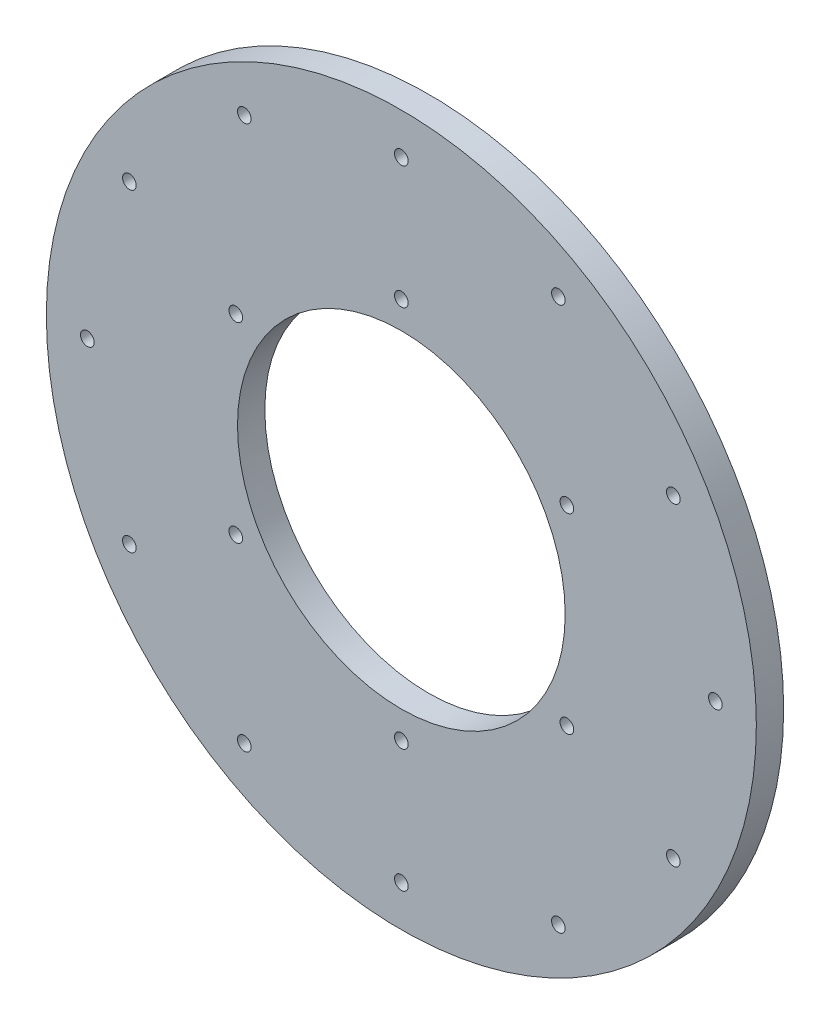
ISO-10303-21;
HEADER;
FILE_DESCRIPTION(('STEP AP214'),'2;1');
FILE_NAME('part.step','',(''),(''),'','','');
FILE_SCHEMA(('AUTOMOTIVE_DESIGN { 1 0 10303 214 1 1 1 1 }'));
ENDSEC;
DATA;
#1=APPLICATION_CONTEXT('core data for automotive mechanical design processes');
#2=APPLICATION_PROTOCOL_DEFINITION('international standard','automotive_design',2000,#1);
#3=PRODUCT_CONTEXT('',#1,'mechanical');
#4=PRODUCT('Part','Part','',(#3));
#5=PRODUCT_RELATED_PRODUCT_CATEGORY('part','',(#4));
#6=PRODUCT_DEFINITION_FORMATION('','',#4);
#7=PRODUCT_DEFINITION_CONTEXT('part definition',#1,'design');
#8=PRODUCT_DEFINITION('design','',#6,#7);
#9=PRODUCT_DEFINITION_SHAPE('','',#8);
#10=(LENGTH_UNIT() NAMED_UNIT(*) SI_UNIT(.MILLI.,.METRE.));
#11=(NAMED_UNIT(*) PLANE_ANGLE_UNIT() SI_UNIT($,.RADIAN.));
#12=(NAMED_UNIT(*) SI_UNIT($,.STERADIAN.) SOLID_ANGLE_UNIT());
#13=UNCERTAINTY_MEASURE_WITH_UNIT(LENGTH_MEASURE(1.E-05),#10,'distance_accuracy_value','');
#14=(GEOMETRIC_REPRESENTATION_CONTEXT(3) GLOBAL_UNCERTAINTY_ASSIGNED_CONTEXT((#13)) GLOBAL_UNIT_ASSIGNED_CONTEXT((#10,
#11,#12)) REPRESENTATION_CONTEXT('',''));
#15=CARTESIAN_POINT('',(0.,0.,0.));
#16=DIRECTION('',(0.,0.,1.));
#17=DIRECTION('',(1.,0.,0.));
#18=AXIS2_PLACEMENT_3D('',#15,#16,#17);
#19=CARTESIAN_POINT('',(0.,0.,10.));
#20=DIRECTION('',(0.,0.,1.));
#21=DIRECTION('',(1.,0.,0.));
#22=AXIS2_PLACEMENT_3D('',#19,#20,#21);
#23=PLANE('',#22);
#24=CARTESIAN_POINT('',(0.,115.,10.));
#25=DIRECTION('',(0.,0.,1.));
#26=DIRECTION('',(1.,0.,0.));
#27=AXIS2_PLACEMENT_3D('',#24,#25,#26);
#28=CIRCLE('',#27,2.5);
#29=CARTESIAN_POINT('',(2.5,115.,10.));
#30=VERTEX_POINT('',#29);
#31=EDGE_CURVE('E119',#30,#30,#28,.T.);
#32=ORIENTED_EDGE('',*,*,#31,.F.);
#33=EDGE_LOOP('',(#32));
#34=FACE_BOUND('',#33,.T.);
#35=CARTESIAN_POINT('',(-57.5,99.5929214352104,10.));
#36=DIRECTION('',(0.,0.,1.));
#37=DIRECTION('',(1.,0.,0.));
#38=AXIS2_PLACEMENT_3D('',#35,#36,#37);
#39=CIRCLE('',#38,2.5);
#40=CARTESIAN_POINT('',(-55.0000000000001,99.5929214352104,10.));
#41=VERTEX_POINT('',#40);
#42=EDGE_CURVE('E147',#41,#41,#39,.T.);
#43=ORIENTED_EDGE('',*,*,#42,.F.);
#44=EDGE_LOOP('',(#43));
#45=FACE_BOUND('',#44,.T.);
#46=CARTESIAN_POINT('',(-99.5929214352105,57.4999999999999,10.));
#47=DIRECTION('',(0.,0.,1.));
#48=DIRECTION('',(1.,0.,0.));
#49=AXIS2_PLACEMENT_3D('',#46,#47,#48);
#50=CIRCLE('',#49,2.50000000000001);
#51=CARTESIAN_POINT('',(-97.0929214352105,57.4999999999999,10.));
#52=VERTEX_POINT('',#51);
#53=EDGE_CURVE('E153',#52,#52,#50,.T.);
#54=ORIENTED_EDGE('',*,*,#53,.F.);
#55=EDGE_LOOP('',(#54));
#56=FACE_BOUND('',#55,.T.);
#57=CARTESIAN_POINT('',(-115.,0.,10.));
#58=DIRECTION('',(0.,0.,1.));
#59=DIRECTION('',(1.,0.,0.));
#60=AXIS2_PLACEMENT_3D('',#57,#58,#59);
#61=CIRCLE('',#60,2.50000000000001);
#62=CARTESIAN_POINT('',(-112.5,0.,10.));
#63=VERTEX_POINT('',#62);
#64=EDGE_CURVE('E124',#63,#63,#61,.T.);
#65=ORIENTED_EDGE('',*,*,#64,.F.);
#66=EDGE_LOOP('',(#65));
#67=FACE_BOUND('',#66,.T.);
#68=CARTESIAN_POINT('',(57.5,99.5929214352104,10.));
#69=DIRECTION('',(0.,0.,1.));
#70=DIRECTION('',(1.,0.,0.));
#71=AXIS2_PLACEMENT_3D('',#68,#69,#70);
#72=CIRCLE('',#71,2.50000000000001);
#73=CARTESIAN_POINT('',(60.,99.5929214352104,10.));
#74=VERTEX_POINT('',#73);
#75=EDGE_CURVE('E116',#74,#74,#72,.T.);
#76=ORIENTED_EDGE('',*,*,#75,.F.);
#77=EDGE_LOOP('',(#76));
#78=FACE_BOUND('',#77,.T.);
#79=CARTESIAN_POINT('',(99.5929214352104,57.5,10.));
#80=DIRECTION('',(0.,0.,1.));
#81=DIRECTION('',(1.,0.,0.));
#82=AXIS2_PLACEMENT_3D('',#79,#80,#81);
#83=CIRCLE('',#82,2.50000000000001);
#84=CARTESIAN_POINT('',(102.09292143521,57.5,10.));
#85=VERTEX_POINT('',#84);
#86=EDGE_CURVE('E110',#85,#85,#83,.T.);
#87=ORIENTED_EDGE('',*,*,#86,.F.);
#88=EDGE_LOOP('',(#87));
#89=FACE_BOUND('',#88,.T.);
#90=CARTESIAN_POINT('',(115.,0.,10.));
#91=DIRECTION('',(0.,0.,1.));
#92=DIRECTION('',(1.,0.,0.));
#93=AXIS2_PLACEMENT_3D('',#90,#91,#92);
#94=CIRCLE('',#93,2.49999999999999);
#95=CARTESIAN_POINT('',(117.5,0.,10.));
#96=VERTEX_POINT('',#95);
#97=EDGE_CURVE('E104',#96,#96,#94,.T.);
#98=ORIENTED_EDGE('',*,*,#97,.F.);
#99=EDGE_LOOP('',(#98));
#100=FACE_BOUND('',#99,.T.);
#101=CARTESIAN_POINT('',(99.5929214352105,-57.5,10.));
#102=DIRECTION('',(0.,0.,1.));
#103=DIRECTION('',(1.,0.,0.));
#104=AXIS2_PLACEMENT_3D('',#101,#102,#103);
#105=CIRCLE('',#104,2.50000000000001);
#106=CARTESIAN_POINT('',(102.09292143521,-57.5,10.));
#107=VERTEX_POINT('',#106);
#108=EDGE_CURVE('E97',#107,#107,#105,.T.);
#109=ORIENTED_EDGE('',*,*,#108,.F.);
#110=EDGE_LOOP('',(#109));
#111=FACE_BOUND('',#110,.T.);
#112=CARTESIAN_POINT('',(57.5,-99.5929214352104,10.));
#113=DIRECTION('',(0.,0.,1.));
#114=DIRECTION('',(1.,0.,0.));
#115=AXIS2_PLACEMENT_3D('',#112,#113,#114);
#116=CIRCLE('',#115,2.50000000000001);
#117=CARTESIAN_POINT('',(60.0000000000001,-99.5929214352104,10.));
#118=VERTEX_POINT('',#117);
#119=EDGE_CURVE('E98',#118,#118,#116,.T.);
#120=ORIENTED_EDGE('',*,*,#119,.F.);
#121=EDGE_LOOP('',(#120));
#122=FACE_BOUND('',#121,.T.);
#123=CARTESIAN_POINT('',(0.,-115.,10.));
#124=DIRECTION('',(0.,0.,1.));
#125=DIRECTION('',(1.,0.,0.));
#126=AXIS2_PLACEMENT_3D('',#123,#124,#125);
#127=CIRCLE('',#126,2.5);
#128=CARTESIAN_POINT('',(2.50000000000002,-115.,10.));
#129=VERTEX_POINT('',#128);
#130=EDGE_CURVE('E136',#129,#129,#127,.T.);
#131=ORIENTED_EDGE('',*,*,#130,.F.);
#132=EDGE_LOOP('',(#131));
#133=FACE_BOUND('',#132,.T.);
#134=CARTESIAN_POINT('',(-57.5,-99.5929214352105,10.));
#135=DIRECTION('',(0.,0.,1.));
#136=DIRECTION('',(1.,0.,0.));
#137=AXIS2_PLACEMENT_3D('',#134,#135,#136);
#138=CIRCLE('',#137,2.5);
#139=CARTESIAN_POINT('',(-55.,-99.5929214352105,10.));
#140=VERTEX_POINT('',#139);
#141=EDGE_CURVE('E130',#140,#140,#138,.T.);
#142=ORIENTED_EDGE('',*,*,#141,.F.);
#143=EDGE_LOOP('',(#142));
#144=FACE_BOUND('',#143,.T.);
#145=CARTESIAN_POINT('',(-99.5929214352104,-57.5,10.));
#146=DIRECTION('',(0.,0.,1.));
#147=DIRECTION('',(1.,0.,0.));
#148=AXIS2_PLACEMENT_3D('',#145,#146,#147);
#149=CIRCLE('',#148,2.5);
#150=CARTESIAN_POINT('',(-97.0929214352104,-57.5,10.));
#151=VERTEX_POINT('',#150);
#152=EDGE_CURVE('E123',#151,#151,#149,.T.);
#153=ORIENTED_EDGE('',*,*,#152,.F.);
#154=EDGE_LOOP('',(#153));
#155=FACE_BOUND('',#154,.T.);
#156=CARTESIAN_POINT('',(0.,70.,10.));
#157=DIRECTION('',(0.,0.,1.));
#158=DIRECTION('',(1.,0.,0.));
#159=AXIS2_PLACEMENT_3D('',#156,#157,#158);
#160=CIRCLE('',#159,2.5);
#161=CARTESIAN_POINT('',(2.5,70.,10.));
#162=VERTEX_POINT('',#161);
#163=EDGE_CURVE('E83',#162,#162,#160,.T.);
#164=ORIENTED_EDGE('',*,*,#163,.F.);
#165=EDGE_LOOP('',(#164));
#166=FACE_BOUND('',#165,.T.);
#167=CARTESIAN_POINT('',(-60.6217782649107,35.,10.));
#168=DIRECTION('',(0.,0.,1.));
#169=DIRECTION('',(1.,0.,0.));
#170=AXIS2_PLACEMENT_3D('',#167,#168,#169);
#171=CIRCLE('',#170,2.50000000000001);
#172=CARTESIAN_POINT('',(-58.1217782649107,35.,10.));
#173=VERTEX_POINT('',#172);
#174=EDGE_CURVE('E62',#173,#173,#171,.T.);
#175=ORIENTED_EDGE('',*,*,#174,.F.);
#176=EDGE_LOOP('',(#175));
#177=FACE_BOUND('',#176,.T.);
#178=CARTESIAN_POINT('',(-60.6217782649107,-35.,10.));
#179=DIRECTION('',(0.,0.,1.));
#180=DIRECTION('',(1.,0.,0.));
#181=AXIS2_PLACEMENT_3D('',#178,#179,#180);
#182=CIRCLE('',#181,2.50000000000001);
#183=CARTESIAN_POINT('',(-58.1217782649107,-35.,10.));
#184=VERTEX_POINT('',#183);
#185=EDGE_CURVE('E61',#184,#184,#182,.T.);
#186=ORIENTED_EDGE('',*,*,#185,.F.);
#187=EDGE_LOOP('',(#186));
#188=FACE_BOUND('',#187,.T.);
#189=CARTESIAN_POINT('',(0.,-70.,10.));
#190=DIRECTION('',(0.,0.,1.));
#191=DIRECTION('',(1.,0.,0.));
#192=AXIS2_PLACEMENT_3D('',#189,#190,#191);
#193=CIRCLE('',#192,2.5);
#194=CARTESIAN_POINT('',(2.50000000000001,-70.,10.));
#195=VERTEX_POINT('',#194);
#196=EDGE_CURVE('E68',#195,#195,#193,.T.);
#197=ORIENTED_EDGE('',*,*,#196,.F.);
#198=EDGE_LOOP('',(#197));
#199=FACE_BOUND('',#198,.T.);
#200=CARTESIAN_POINT('',(60.6217782649107,-35.,10.));
#201=DIRECTION('',(0.,0.,1.));
#202=DIRECTION('',(1.,0.,0.));
#203=AXIS2_PLACEMENT_3D('',#200,#201,#202);
#204=CIRCLE('',#203,2.50000000000001);
#205=CARTESIAN_POINT('',(63.1217782649108,-35.,10.));
#206=VERTEX_POINT('',#205);
#207=EDGE_CURVE('E74',#206,#206,#204,.T.);
#208=ORIENTED_EDGE('',*,*,#207,.F.);
#209=EDGE_LOOP('',(#208));
#210=FACE_BOUND('',#209,.T.);
#211=CARTESIAN_POINT('',(60.6217782649107,35.,10.));
#212=DIRECTION('',(0.,0.,1.));
#213=DIRECTION('',(1.,0.,0.));
#214=AXIS2_PLACEMENT_3D('',#211,#212,#213);
#215=CIRCLE('',#214,2.5);
#216=CARTESIAN_POINT('',(63.1217782649107,35.,10.));
#217=VERTEX_POINT('',#216);
#218=EDGE_CURVE('E80',#217,#217,#215,.T.);
#219=ORIENTED_EDGE('',*,*,#218,.F.);
#220=EDGE_LOOP('',(#219));
#221=FACE_BOUND('',#220,.T.);
#222=CARTESIAN_POINT('',(0.,0.,10.));
#223=DIRECTION('',(0.,0.,1.));
#224=DIRECTION('',(1.,0.,0.));
#225=AXIS2_PLACEMENT_3D('',#222,#223,#224);
#226=CIRCLE('',#225,130.);
#227=CARTESIAN_POINT('',(130.,0.,10.));
#228=VERTEX_POINT('',#227);
#229=EDGE_CURVE('E10',#228,#228,#226,.T.);
#230=ORIENTED_EDGE('',*,*,#229,.T.);
#231=EDGE_LOOP('',(#230));
#232=FACE_BOUND('',#231,.T.);
#233=CARTESIAN_POINT('',(0.,0.,10.));
#234=DIRECTION('',(0.,0.,1.));
#235=DIRECTION('',(1.,0.,0.));
#236=AXIS2_PLACEMENT_3D('',#233,#234,#235);
#237=CIRCLE('',#236,60.);
#238=CARTESIAN_POINT('',(60.,0.,10.));
#239=VERTEX_POINT('',#238);
#240=EDGE_CURVE('E50',#239,#239,#237,.T.);
#241=ORIENTED_EDGE('',*,*,#240,.F.);
#242=EDGE_LOOP('',(#241));
#243=FACE_BOUND('',#242,.T.);
#244=ADVANCED_FACE('F39',(#34,#45,#56,#67,#78,#89,#100,#111,#122,#133,#144,#155,#166,#177,#188,
#199,#210,#221,#232,#243),#23,.T.);
#245=CARTESIAN_POINT('',(0.,0.,0.));
#246=DIRECTION('',(0.,0.,1.));
#247=DIRECTION('',(1.,0.,0.));
#248=AXIS2_PLACEMENT_3D('',#245,#246,#247);
#249=PLANE('',#248);
#250=CARTESIAN_POINT('',(0.,115.,0.));
#251=DIRECTION('',(0.,0.,1.));
#252=DIRECTION('',(1.,0.,0.));
#253=AXIS2_PLACEMENT_3D('',#250,#251,#252);
#254=CIRCLE('',#253,2.5);
#255=CARTESIAN_POINT('',(2.5,115.,0.));
#256=VERTEX_POINT('',#255);
#257=EDGE_CURVE('E87',#256,#256,#254,.T.);
#258=ORIENTED_EDGE('',*,*,#257,.T.);
#259=EDGE_LOOP('',(#258));
#260=FACE_BOUND('',#259,.T.);
#261=CARTESIAN_POINT('',(-57.5,99.5929214352104,0.));
#262=DIRECTION('',(0.,0.,1.));
#263=DIRECTION('',(1.,0.,0.));
#264=AXIS2_PLACEMENT_3D('',#261,#262,#263);
#265=CIRCLE('',#264,2.5);
#266=CARTESIAN_POINT('',(-55.0000000000001,99.5929214352104,0.));
#267=VERTEX_POINT('',#266);
#268=EDGE_CURVE('E144',#267,#267,#265,.T.);
#269=ORIENTED_EDGE('',*,*,#268,.T.);
#270=EDGE_LOOP('',(#269));
#271=FACE_BOUND('',#270,.T.);
#272=CARTESIAN_POINT('',(-99.5929214352105,57.4999999999999,0.));
#273=DIRECTION('',(0.,0.,1.));
#274=DIRECTION('',(1.,0.,0.));
#275=AXIS2_PLACEMENT_3D('',#272,#273,#274);
#276=CIRCLE('',#275,2.50000000000001);
#277=CARTESIAN_POINT('',(-97.0929214352105,57.4999999999999,0.));
#278=VERTEX_POINT('',#277);
#279=EDGE_CURVE('E150',#278,#278,#276,.T.);
#280=ORIENTED_EDGE('',*,*,#279,.T.);
#281=EDGE_LOOP('',(#280));
#282=FACE_BOUND('',#281,.T.);
#283=CARTESIAN_POINT('',(-115.,0.,0.));
#284=DIRECTION('',(0.,0.,1.));
#285=DIRECTION('',(1.,0.,0.));
#286=AXIS2_PLACEMENT_3D('',#283,#284,#285);
#287=CIRCLE('',#286,2.50000000000001);
#288=CARTESIAN_POINT('',(-112.5,0.,0.));
#289=VERTEX_POINT('',#288);
#290=EDGE_CURVE('E156',#289,#289,#287,.T.);
#291=ORIENTED_EDGE('',*,*,#290,.T.);
#292=EDGE_LOOP('',(#291));
#293=FACE_BOUND('',#292,.T.);
#294=CARTESIAN_POINT('',(57.5,99.5929214352104,0.));
#295=DIRECTION('',(0.,0.,1.));
#296=DIRECTION('',(1.,0.,0.));
#297=AXIS2_PLACEMENT_3D('',#294,#295,#296);
#298=CIRCLE('',#297,2.50000000000001);
#299=CARTESIAN_POINT('',(60.,99.5929214352104,0.));
#300=VERTEX_POINT('',#299);
#301=EDGE_CURVE('E113',#300,#300,#298,.T.);
#302=ORIENTED_EDGE('',*,*,#301,.T.);
#303=EDGE_LOOP('',(#302));
#304=FACE_BOUND('',#303,.T.);
#305=CARTESIAN_POINT('',(99.5929214352104,57.5,0.));
#306=DIRECTION('',(0.,0.,1.));
#307=DIRECTION('',(1.,0.,0.));
#308=AXIS2_PLACEMENT_3D('',#305,#306,#307);
#309=CIRCLE('',#308,2.50000000000001);
#310=CARTESIAN_POINT('',(102.09292143521,57.5,0.));
#311=VERTEX_POINT('',#310);
#312=EDGE_CURVE('E107',#311,#311,#309,.T.);
#313=ORIENTED_EDGE('',*,*,#312,.T.);
#314=EDGE_LOOP('',(#313));
#315=FACE_BOUND('',#314,.T.);
#316=CARTESIAN_POINT('',(115.,0.,0.));
#317=DIRECTION('',(0.,0.,1.));
#318=DIRECTION('',(1.,0.,0.));
#319=AXIS2_PLACEMENT_3D('',#316,#317,#318);
#320=CIRCLE('',#319,2.49999999999999);
#321=CARTESIAN_POINT('',(117.5,0.,0.));
#322=VERTEX_POINT('',#321);
#323=EDGE_CURVE('E101',#322,#322,#320,.T.);
#324=ORIENTED_EDGE('',*,*,#323,.T.);
#325=EDGE_LOOP('',(#324));
#326=FACE_BOUND('',#325,.T.);
#327=CARTESIAN_POINT('',(99.5929214352105,-57.5,0.));
#328=DIRECTION('',(0.,0.,1.));
#329=DIRECTION('',(1.,0.,0.));
#330=AXIS2_PLACEMENT_3D('',#327,#328,#329);
#331=CIRCLE('',#330,2.50000000000001);
#332=CARTESIAN_POINT('',(102.09292143521,-57.5,0.));
#333=VERTEX_POINT('',#332);
#334=EDGE_CURVE('E94',#333,#333,#331,.T.);
#335=ORIENTED_EDGE('',*,*,#334,.T.);
#336=EDGE_LOOP('',(#335));
#337=FACE_BOUND('',#336,.T.);
#338=CARTESIAN_POINT('',(57.5,-99.5929214352104,0.));
#339=DIRECTION('',(0.,0.,1.));
#340=DIRECTION('',(1.,0.,0.));
#341=AXIS2_PLACEMENT_3D('',#338,#339,#340);
#342=CIRCLE('',#341,2.50000000000001);
#343=CARTESIAN_POINT('',(60.0000000000001,-99.5929214352104,0.));
#344=VERTEX_POINT('',#343);
#345=EDGE_CURVE('E139',#344,#344,#342,.T.);
#346=ORIENTED_EDGE('',*,*,#345,.T.);
#347=EDGE_LOOP('',(#346));
#348=FACE_BOUND('',#347,.T.);
#349=CARTESIAN_POINT('',(0.,-115.,0.));
#350=DIRECTION('',(0.,0.,1.));
#351=DIRECTION('',(1.,0.,0.));
#352=AXIS2_PLACEMENT_3D('',#349,#350,#351);
#353=CIRCLE('',#352,2.5);
#354=CARTESIAN_POINT('',(2.50000000000002,-115.,0.));
#355=VERTEX_POINT('',#354);
#356=EDGE_CURVE('E133',#355,#355,#353,.T.);
#357=ORIENTED_EDGE('',*,*,#356,.T.);
#358=EDGE_LOOP('',(#357));
#359=FACE_BOUND('',#358,.T.);
#360=CARTESIAN_POINT('',(-57.5,-99.5929214352105,0.));
#361=DIRECTION('',(0.,0.,1.));
#362=DIRECTION('',(1.,0.,0.));
#363=AXIS2_PLACEMENT_3D('',#360,#361,#362);
#364=CIRCLE('',#363,2.5);
#365=CARTESIAN_POINT('',(-55.,-99.5929214352105,0.));
#366=VERTEX_POINT('',#365);
#367=EDGE_CURVE('E127',#366,#366,#364,.T.);
#368=ORIENTED_EDGE('',*,*,#367,.T.);
#369=EDGE_LOOP('',(#368));
#370=FACE_BOUND('',#369,.T.);
#371=CARTESIAN_POINT('',(-99.5929214352104,-57.5,0.));
#372=DIRECTION('',(0.,0.,1.));
#373=DIRECTION('',(1.,0.,0.));
#374=AXIS2_PLACEMENT_3D('',#371,#372,#373);
#375=CIRCLE('',#374,2.5);
#376=CARTESIAN_POINT('',(-97.0929214352104,-57.5,0.));
#377=VERTEX_POINT('',#376);
#378=EDGE_CURVE('E120',#377,#377,#375,.T.);
#379=ORIENTED_EDGE('',*,*,#378,.T.);
#380=EDGE_LOOP('',(#379));
#381=FACE_BOUND('',#380,.T.);
#382=CARTESIAN_POINT('',(0.,70.,0.));
#383=DIRECTION('',(0.,0.,1.));
#384=DIRECTION('',(1.,0.,0.));
#385=AXIS2_PLACEMENT_3D('',#382,#383,#384);
#386=CIRCLE('',#385,2.5);
#387=CARTESIAN_POINT('',(2.5,70.,0.));
#388=VERTEX_POINT('',#387);
#389=EDGE_CURVE('E55',#388,#388,#386,.T.);
#390=ORIENTED_EDGE('',*,*,#389,.T.);
#391=EDGE_LOOP('',(#390));
#392=FACE_BOUND('',#391,.T.);
#393=CARTESIAN_POINT('',(-60.6217782649107,35.,0.));
#394=DIRECTION('',(0.,0.,1.));
#395=DIRECTION('',(1.,0.,0.));
#396=AXIS2_PLACEMENT_3D('',#393,#394,#395);
#397=CIRCLE('',#396,2.50000000000001);
#398=CARTESIAN_POINT('',(-58.1217782649107,35.,0.));
#399=VERTEX_POINT('',#398);
#400=EDGE_CURVE('E84',#399,#399,#397,.T.);
#401=ORIENTED_EDGE('',*,*,#400,.T.);
#402=EDGE_LOOP('',(#401));
#403=FACE_BOUND('',#402,.T.);
#404=CARTESIAN_POINT('',(-60.6217782649107,-35.,0.));
#405=DIRECTION('',(0.,0.,1.));
#406=DIRECTION('',(1.,0.,0.));
#407=AXIS2_PLACEMENT_3D('',#404,#405,#406);
#408=CIRCLE('',#407,2.50000000000001);
#409=CARTESIAN_POINT('',(-58.1217782649107,-35.,0.));
#410=VERTEX_POINT('',#409);
#411=EDGE_CURVE('E58',#410,#410,#408,.T.);
#412=ORIENTED_EDGE('',*,*,#411,.T.);
#413=EDGE_LOOP('',(#412));
#414=FACE_BOUND('',#413,.T.);
#415=CARTESIAN_POINT('',(0.,-70.,0.));
#416=DIRECTION('',(0.,0.,1.));
#417=DIRECTION('',(1.,0.,0.));
#418=AXIS2_PLACEMENT_3D('',#415,#416,#417);
#419=CIRCLE('',#418,2.5);
#420=CARTESIAN_POINT('',(2.50000000000001,-70.,0.));
#421=VERTEX_POINT('',#420);
#422=EDGE_CURVE('E65',#421,#421,#419,.T.);
#423=ORIENTED_EDGE('',*,*,#422,.T.);
#424=EDGE_LOOP('',(#423));
#425=FACE_BOUND('',#424,.T.);
#426=CARTESIAN_POINT('',(60.6217782649107,-35.,0.));
#427=DIRECTION('',(0.,0.,1.));
#428=DIRECTION('',(1.,0.,0.));
#429=AXIS2_PLACEMENT_3D('',#426,#427,#428);
#430=CIRCLE('',#429,2.50000000000001);
#431=CARTESIAN_POINT('',(63.1217782649108,-35.,0.));
#432=VERTEX_POINT('',#431);
#433=EDGE_CURVE('E71',#432,#432,#430,.T.);
#434=ORIENTED_EDGE('',*,*,#433,.T.);
#435=EDGE_LOOP('',(#434));
#436=FACE_BOUND('',#435,.T.);
#437=CARTESIAN_POINT('',(60.6217782649107,35.,0.));
#438=DIRECTION('',(0.,0.,1.));
#439=DIRECTION('',(1.,0.,0.));
#440=AXIS2_PLACEMENT_3D('',#437,#438,#439);
#441=CIRCLE('',#440,2.5);
#442=CARTESIAN_POINT('',(63.1217782649107,35.,0.));
#443=VERTEX_POINT('',#442);
#444=EDGE_CURVE('E77',#443,#443,#441,.T.);
#445=ORIENTED_EDGE('',*,*,#444,.T.);
#446=EDGE_LOOP('',(#445));
#447=FACE_BOUND('',#446,.T.);
#448=CARTESIAN_POINT('',(0.,0.,0.));
#449=DIRECTION('',(0.,0.,1.));
#450=DIRECTION('',(1.,0.,0.));
#451=AXIS2_PLACEMENT_3D('',#448,#449,#450);
#452=CIRCLE('',#451,130.);
#453=CARTESIAN_POINT('',(130.,0.,0.));
#454=VERTEX_POINT('',#453);
#455=EDGE_CURVE('E43',#454,#454,#452,.T.);
#456=ORIENTED_EDGE('',*,*,#455,.F.);
#457=EDGE_LOOP('',(#456));
#458=FACE_BOUND('',#457,.T.);
#459=CARTESIAN_POINT('',(0.,0.,0.));
#460=DIRECTION('',(0.,0.,1.));
#461=DIRECTION('',(1.,0.,0.));
#462=AXIS2_PLACEMENT_3D('',#459,#460,#461);
#463=CIRCLE('',#462,60.);
#464=CARTESIAN_POINT('',(60.,0.,0.));
#465=VERTEX_POINT('',#464);
#466=EDGE_CURVE('E52',#465,#465,#463,.T.);
#467=ORIENTED_EDGE('',*,*,#466,.T.);
#468=EDGE_LOOP('',(#467));
#469=FACE_BOUND('',#468,.T.);
#470=ADVANCED_FACE('F166',(#260,#271,#282,#293,#304,#315,#326,#337,#348,#359,#370,#381,#392,
#403,#414,#425,#436,#447,#458,#469),#249,.F.);
#471=CARTESIAN_POINT('',(0.,0.,10.));
#472=DIRECTION('',(0.,0.,-1.));
#473=DIRECTION('',(-1.,0.,0.));
#474=AXIS2_PLACEMENT_3D('',#471,#472,#473);
#475=CYLINDRICAL_SURFACE('',#474,130.);
#476=ORIENTED_EDGE('',*,*,#229,.F.);
#477=EDGE_LOOP('',(#476));
#478=FACE_BOUND('',#477,.T.);
#479=ORIENTED_EDGE('',*,*,#455,.T.);
#480=EDGE_LOOP('',(#479));
#481=FACE_BOUND('',#480,.T.);
#482=ADVANCED_FACE('F41',(#478,#481),#475,.T.);
#483=CARTESIAN_POINT('',(0.,0.,10.));
#484=DIRECTION('',(0.,0.,-1.));
#485=DIRECTION('',(-1.,0.,0.));
#486=AXIS2_PLACEMENT_3D('',#483,#484,#485);
#487=CYLINDRICAL_SURFACE('',#486,60.);
#488=ORIENTED_EDGE('',*,*,#240,.T.);
#489=EDGE_LOOP('',(#488));
#490=FACE_BOUND('',#489,.T.);
#491=ORIENTED_EDGE('',*,*,#466,.F.);
#492=EDGE_LOOP('',(#491));
#493=FACE_BOUND('',#492,.T.);
#494=ADVANCED_FACE('F215',(#490,#493),#487,.F.);
#495=CARTESIAN_POINT('',(60.6217782649107,35.,0.));
#496=DIRECTION('',(0.,0.,1.));
#497=DIRECTION('',(1.,0.,0.));
#498=AXIS2_PLACEMENT_3D('',#495,#496,#497);
#499=CYLINDRICAL_SURFACE('',#498,2.5);
#500=ORIENTED_EDGE('',*,*,#444,.F.);
#501=EDGE_LOOP('',(#500));
#502=FACE_BOUND('',#501,.T.);
#503=ORIENTED_EDGE('',*,*,#218,.T.);
#504=EDGE_LOOP('',(#503));
#505=FACE_BOUND('',#504,.T.);
#506=ADVANCED_FACE('F218',(#502,#505),#499,.F.);
#507=CARTESIAN_POINT('',(60.6217782649107,-35.,0.));
#508=DIRECTION('',(0.,0.,1.));
#509=DIRECTION('',(1.,0.,0.));
#510=AXIS2_PLACEMENT_3D('',#507,#508,#509);
#511=CYLINDRICAL_SURFACE('',#510,2.50000000000001);
#512=ORIENTED_EDGE('',*,*,#433,.F.);
#513=EDGE_LOOP('',(#512));
#514=FACE_BOUND('',#513,.T.);
#515=ORIENTED_EDGE('',*,*,#207,.T.);
#516=EDGE_LOOP('',(#515));
#517=FACE_BOUND('',#516,.T.);
#518=ADVANCED_FACE('F237',(#514,#517),#511,.F.);
#519=CARTESIAN_POINT('',(0.,-70.,0.));
#520=DIRECTION('',(0.,0.,1.));
#521=DIRECTION('',(1.,0.,0.));
#522=AXIS2_PLACEMENT_3D('',#519,#520,#521);
#523=CYLINDRICAL_SURFACE('',#522,2.5);
#524=ORIENTED_EDGE('',*,*,#422,.F.);
#525=EDGE_LOOP('',(#524));
#526=FACE_BOUND('',#525,.T.);
#527=ORIENTED_EDGE('',*,*,#196,.T.);
#528=EDGE_LOOP('',(#527));
#529=FACE_BOUND('',#528,.T.);
#530=ADVANCED_FACE('F233',(#526,#529),#523,.F.);
#531=CARTESIAN_POINT('',(-60.6217782649107,-35.,0.));
#532=DIRECTION('',(0.,0.,1.));
#533=DIRECTION('',(1.,0.,0.));
#534=AXIS2_PLACEMENT_3D('',#531,#532,#533);
#535=CYLINDRICAL_SURFACE('',#534,2.50000000000001);
#536=ORIENTED_EDGE('',*,*,#411,.F.);
#537=EDGE_LOOP('',(#536));
#538=FACE_BOUND('',#537,.T.);
#539=ORIENTED_EDGE('',*,*,#185,.T.);
#540=EDGE_LOOP('',(#539));
#541=FACE_BOUND('',#540,.T.);
#542=ADVANCED_FACE('F229',(#538,#541),#535,.F.);
#543=CARTESIAN_POINT('',(-60.6217782649107,35.,0.));
#544=DIRECTION('',(0.,0.,1.));
#545=DIRECTION('',(1.,0.,0.));
#546=AXIS2_PLACEMENT_3D('',#543,#544,#545);
#547=CYLINDRICAL_SURFACE('',#546,2.50000000000001);
#548=ORIENTED_EDGE('',*,*,#400,.F.);
#549=EDGE_LOOP('',(#548));
#550=FACE_BOUND('',#549,.T.);
#551=ORIENTED_EDGE('',*,*,#174,.T.);
#552=EDGE_LOOP('',(#551));
#553=FACE_BOUND('',#552,.T.);
#554=ADVANCED_FACE('F232',(#550,#553),#547,.F.);
#555=CARTESIAN_POINT('',(0.,70.,0.));
#556=DIRECTION('',(0.,0.,1.));
#557=DIRECTION('',(1.,0.,0.));
#558=AXIS2_PLACEMENT_3D('',#555,#556,#557);
#559=CYLINDRICAL_SURFACE('',#558,2.5);
#560=ORIENTED_EDGE('',*,*,#389,.F.);
#561=EDGE_LOOP('',(#560));
#562=FACE_BOUND('',#561,.T.);
#563=ORIENTED_EDGE('',*,*,#163,.T.);
#564=EDGE_LOOP('',(#563));
#565=FACE_BOUND('',#564,.T.);
#566=ADVANCED_FACE('F247',(#562,#565),#559,.F.);
#567=CARTESIAN_POINT('',(-99.5929214352104,-57.5,0.));
#568=DIRECTION('',(0.,0.,1.));
#569=DIRECTION('',(1.,0.,0.));
#570=AXIS2_PLACEMENT_3D('',#567,#568,#569);
#571=CYLINDRICAL_SURFACE('',#570,2.5);
#572=ORIENTED_EDGE('',*,*,#378,.F.);
#573=EDGE_LOOP('',(#572));
#574=FACE_BOUND('',#573,.T.);
#575=ORIENTED_EDGE('',*,*,#152,.T.);
#576=EDGE_LOOP('',(#575));
#577=FACE_BOUND('',#576,.T.);
#578=ADVANCED_FACE('F251',(#574,#577),#571,.F.);
#579=CARTESIAN_POINT('',(-57.5,-99.5929214352105,0.));
#580=DIRECTION('',(0.,0.,1.));
#581=DIRECTION('',(1.,0.,0.));
#582=AXIS2_PLACEMENT_3D('',#579,#580,#581);
#583=CYLINDRICAL_SURFACE('',#582,2.5);
#584=ORIENTED_EDGE('',*,*,#367,.F.);
#585=EDGE_LOOP('',(#584));
#586=FACE_BOUND('',#585,.T.);
#587=ORIENTED_EDGE('',*,*,#141,.T.);
#588=EDGE_LOOP('',(#587));
#589=FACE_BOUND('',#588,.T.);
#590=ADVANCED_FACE('F272',(#586,#589),#583,.F.);
#591=CARTESIAN_POINT('',(0.,-115.,0.));
#592=DIRECTION('',(0.,0.,1.));
#593=DIRECTION('',(1.,0.,0.));
#594=AXIS2_PLACEMENT_3D('',#591,#592,#593);
#595=CYLINDRICAL_SURFACE('',#594,2.5);
#596=ORIENTED_EDGE('',*,*,#356,.F.);
#597=EDGE_LOOP('',(#596));
#598=FACE_BOUND('',#597,.T.);
#599=ORIENTED_EDGE('',*,*,#130,.T.);
#600=EDGE_LOOP('',(#599));
#601=FACE_BOUND('',#600,.T.);
#602=ADVANCED_FACE('F276',(#598,#601),#595,.F.);
#603=CARTESIAN_POINT('',(57.5,-99.5929214352104,0.));
#604=DIRECTION('',(0.,0.,1.));
#605=DIRECTION('',(1.,0.,0.));
#606=AXIS2_PLACEMENT_3D('',#603,#604,#605);
#607=CYLINDRICAL_SURFACE('',#606,2.50000000000001);
#608=ORIENTED_EDGE('',*,*,#345,.F.);
#609=EDGE_LOOP('',(#608));
#610=FACE_BOUND('',#609,.T.);
#611=ORIENTED_EDGE('',*,*,#119,.T.);
#612=EDGE_LOOP('',(#611));
#613=FACE_BOUND('',#612,.T.);
#614=ADVANCED_FACE('F257',(#610,#613),#607,.F.);
#615=CARTESIAN_POINT('',(99.5929214352105,-57.5,0.));
#616=DIRECTION('',(0.,0.,1.));
#617=DIRECTION('',(1.,0.,0.));
#618=AXIS2_PLACEMENT_3D('',#615,#616,#617);
#619=CYLINDRICAL_SURFACE('',#618,2.50000000000001);
#620=ORIENTED_EDGE('',*,*,#334,.F.);
#621=EDGE_LOOP('',(#620));
#622=FACE_BOUND('',#621,.T.);
#623=ORIENTED_EDGE('',*,*,#108,.T.);
#624=EDGE_LOOP('',(#623));
#625=FACE_BOUND('',#624,.T.);
#626=ADVANCED_FACE('F253',(#622,#625),#619,.F.);
#627=CARTESIAN_POINT('',(115.,0.,0.));
#628=DIRECTION('',(0.,0.,1.));
#629=DIRECTION('',(1.,0.,0.));
#630=AXIS2_PLACEMENT_3D('',#627,#628,#629);
#631=CYLINDRICAL_SURFACE('',#630,2.49999999999999);
#632=ORIENTED_EDGE('',*,*,#323,.F.);
#633=EDGE_LOOP('',(#632));
#634=FACE_BOUND('',#633,.T.);
#635=ORIENTED_EDGE('',*,*,#97,.T.);
#636=EDGE_LOOP('',(#635));
#637=FACE_BOUND('',#636,.T.);
#638=ADVANCED_FACE('F256',(#634,#637),#631,.F.);
#639=CARTESIAN_POINT('',(99.5929214352104,57.5,0.));
#640=DIRECTION('',(0.,0.,1.));
#641=DIRECTION('',(1.,0.,0.));
#642=AXIS2_PLACEMENT_3D('',#639,#640,#641);
#643=CYLINDRICAL_SURFACE('',#642,2.50000000000001);
#644=ORIENTED_EDGE('',*,*,#312,.F.);
#645=EDGE_LOOP('',(#644));
#646=FACE_BOUND('',#645,.T.);
#647=ORIENTED_EDGE('',*,*,#86,.T.);
#648=EDGE_LOOP('',(#647));
#649=FACE_BOUND('',#648,.T.);
#650=ADVANCED_FACE('F261',(#646,#649),#643,.F.);
#651=CARTESIAN_POINT('',(57.5,99.5929214352104,0.));
#652=DIRECTION('',(0.,0.,1.));
#653=DIRECTION('',(1.,0.,0.));
#654=AXIS2_PLACEMENT_3D('',#651,#652,#653);
#655=CYLINDRICAL_SURFACE('',#654,2.50000000000001);
#656=ORIENTED_EDGE('',*,*,#301,.F.);
#657=EDGE_LOOP('',(#656));
#658=FACE_BOUND('',#657,.T.);
#659=ORIENTED_EDGE('',*,*,#75,.T.);
#660=EDGE_LOOP('',(#659));
#661=FACE_BOUND('',#660,.T.);
#662=ADVANCED_FACE('F265',(#658,#661),#655,.F.);
#663=CARTESIAN_POINT('',(-115.,0.,0.));
#664=DIRECTION('',(0.,0.,1.));
#665=DIRECTION('',(1.,0.,0.));
#666=AXIS2_PLACEMENT_3D('',#663,#664,#665);
#667=CYLINDRICAL_SURFACE('',#666,2.50000000000001);
#668=ORIENTED_EDGE('',*,*,#290,.F.);
#669=EDGE_LOOP('',(#668));
#670=FACE_BOUND('',#669,.T.);
#671=ORIENTED_EDGE('',*,*,#64,.T.);
#672=EDGE_LOOP('',(#671));
#673=FACE_BOUND('',#672,.T.);
#674=ADVANCED_FACE('F269',(#670,#673),#667,.F.);
#675=CARTESIAN_POINT('',(-99.5929214352105,57.4999999999999,0.));
#676=DIRECTION('',(0.,0.,1.));
#677=DIRECTION('',(1.,0.,0.));
#678=AXIS2_PLACEMENT_3D('',#675,#676,#677);
#679=CYLINDRICAL_SURFACE('',#678,2.50000000000001);
#680=ORIENTED_EDGE('',*,*,#279,.F.);
#681=EDGE_LOOP('',(#680));
#682=FACE_BOUND('',#681,.T.);
#683=ORIENTED_EDGE('',*,*,#53,.T.);
#684=EDGE_LOOP('',(#683));
#685=FACE_BOUND('',#684,.T.);
#686=ADVANCED_FACE('F286',(#682,#685),#679,.F.);
#687=CARTESIAN_POINT('',(-57.5,99.5929214352104,0.));
#688=DIRECTION('',(0.,0.,1.));
#689=DIRECTION('',(1.,0.,0.));
#690=AXIS2_PLACEMENT_3D('',#687,#688,#689);
#691=CYLINDRICAL_SURFACE('',#690,2.5);
#692=ORIENTED_EDGE('',*,*,#268,.F.);
#693=EDGE_LOOP('',(#692));
#694=FACE_BOUND('',#693,.T.);
#695=ORIENTED_EDGE('',*,*,#42,.T.);
#696=EDGE_LOOP('',(#695));
#697=FACE_BOUND('',#696,.T.);
#698=ADVANCED_FACE('F172',(#694,#697),#691,.F.);
#699=CARTESIAN_POINT('',(0.,115.,0.));
#700=DIRECTION('',(0.,0.,1.));
#701=DIRECTION('',(1.,0.,0.));
#702=AXIS2_PLACEMENT_3D('',#699,#700,#701);
#703=CYLINDRICAL_SURFACE('',#702,2.5);
#704=ORIENTED_EDGE('',*,*,#257,.F.);
#705=EDGE_LOOP('',(#704));
#706=FACE_BOUND('',#705,.T.);
#707=ORIENTED_EDGE('',*,*,#31,.T.);
#708=EDGE_LOOP('',(#707));
#709=FACE_BOUND('',#708,.T.);
#710=ADVANCED_FACE('F169',(#706,#709),#703,.F.);
#711=CLOSED_SHELL('',(#244,#470,#482,#494,#506,#518,#530,#542,#554,#566,#578,#590,#602,#614,
#626,#638,#650,#662,#674,#686,#698,#710));
#712=MANIFOLD_SOLID_BREP('B2',#711);
#713=ADVANCED_BREP_SHAPE_REPRESENTATION('',(#18,#712),#14);
#714=SHAPE_DEFINITION_REPRESENTATION(#9,#713);
ENDSEC;
END-ISO-10303-21;
